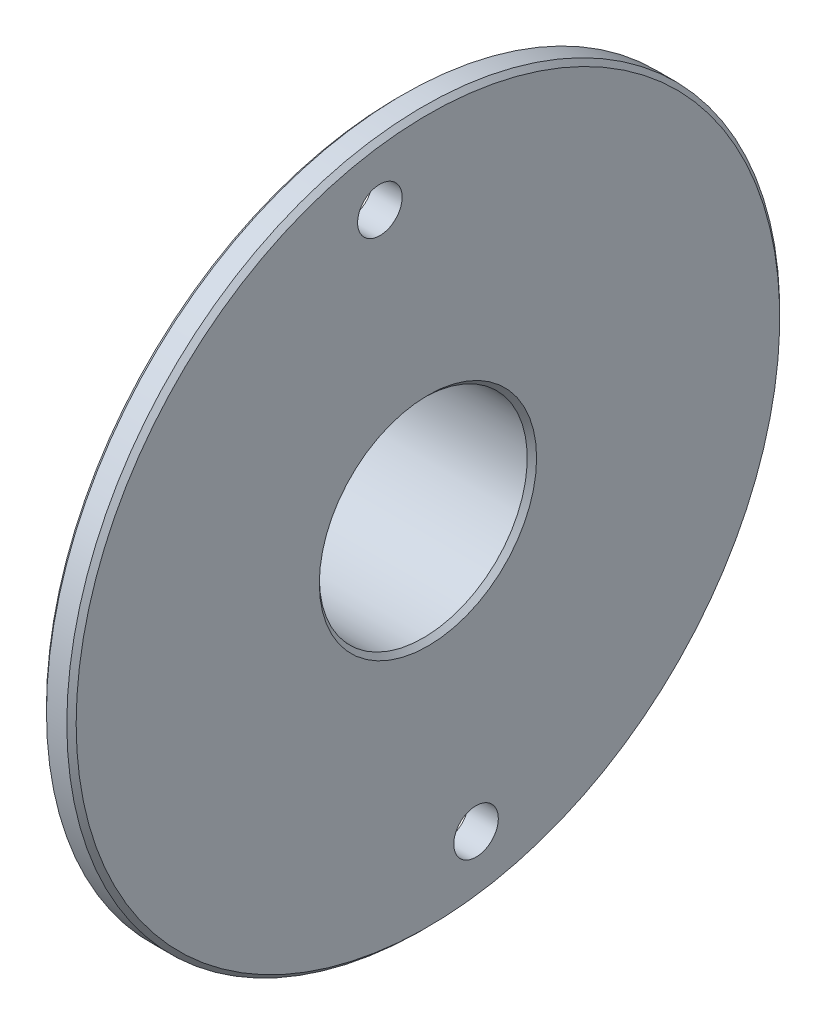
ISO-10303-21;
HEADER;
FILE_DESCRIPTION(('STEP AP214'),'2;1');
FILE_NAME('part.step','',(''),(''),'','','');
FILE_SCHEMA(('AUTOMOTIVE_DESIGN { 1 0 10303 214 1 1 1 1 }'));
ENDSEC;
DATA;
#1=APPLICATION_CONTEXT('core data for automotive mechanical design processes');
#2=APPLICATION_PROTOCOL_DEFINITION('international standard','automotive_design',2000,#1);
#3=PRODUCT_CONTEXT('',#1,'mechanical');
#4=PRODUCT('Part','Part','',(#3));
#5=PRODUCT_RELATED_PRODUCT_CATEGORY('part','',(#4));
#6=PRODUCT_DEFINITION_FORMATION('','',#4);
#7=PRODUCT_DEFINITION_CONTEXT('part definition',#1,'design');
#8=PRODUCT_DEFINITION('design','',#6,#7);
#9=PRODUCT_DEFINITION_SHAPE('','',#8);
#10=(LENGTH_UNIT() NAMED_UNIT(*) SI_UNIT(.MILLI.,.METRE.));
#11=(NAMED_UNIT(*) PLANE_ANGLE_UNIT() SI_UNIT($,.RADIAN.));
#12=(NAMED_UNIT(*) SI_UNIT($,.STERADIAN.) SOLID_ANGLE_UNIT());
#13=UNCERTAINTY_MEASURE_WITH_UNIT(LENGTH_MEASURE(1.E-05),#10,'distance_accuracy_value','');
#14=(GEOMETRIC_REPRESENTATION_CONTEXT(3) GLOBAL_UNCERTAINTY_ASSIGNED_CONTEXT((#13)) GLOBAL_UNIT_ASSIGNED_CONTEXT((#10,
#11,#12)) REPRESENTATION_CONTEXT('',''));
#15=CARTESIAN_POINT('',(0.,0.,0.));
#16=DIRECTION('',(0.,0.,1.));
#17=DIRECTION('',(1.,0.,0.));
#18=AXIS2_PLACEMENT_3D('',#15,#16,#17);
#19=CARTESIAN_POINT('',(0.,14.2875,0.));
#20=DIRECTION('',(1.,0.,0.));
#21=DIRECTION('',(0.,0.,-1.));
#22=AXIS2_PLACEMENT_3D('',#19,#20,#21);
#23=PLANE('',#22);
#24=CARTESIAN_POINT('',(0.,31.3312952376656,5.1393033312147));
#25=DIRECTION('',(1.,0.,0.));
#26=DIRECTION('',(0.,0.,-1.));
#27=AXIS2_PLACEMENT_3D('',#24,#25,#26);
#28=CIRCLE('',#27,2.38125);
#29=CARTESIAN_POINT('',(0.,31.3312952376656,2.7580533312147));
#30=VERTEX_POINT('',#29);
#31=EDGE_CURVE('E90',#30,#30,#28,.T.);
#32=ORIENTED_EDGE('',*,*,#31,.T.);
#33=EDGE_LOOP('',(#32));
#34=FACE_BOUND('',#33,.T.);
#35=CARTESIAN_POINT('',(0.,-31.3312952376656,-5.13930333121448));
#36=DIRECTION('',(1.,0.,0.));
#37=DIRECTION('',(0.,0.,-1.));
#38=AXIS2_PLACEMENT_3D('',#35,#36,#37);
#39=CIRCLE('',#38,2.38125);
#40=CARTESIAN_POINT('',(0.,-31.3312952376656,-7.52055333121448));
#41=VERTEX_POINT('',#40);
#42=EDGE_CURVE('E94',#41,#41,#39,.T.);
#43=ORIENTED_EDGE('',*,*,#42,.T.);
#44=EDGE_LOOP('',(#43));
#45=FACE_BOUND('',#44,.T.);
#46=CARTESIAN_POINT('',(0.,0.,0.));
#47=DIRECTION('',(-1.,0.,0.));
#48=DIRECTION('',(0.,0.,1.));
#49=AXIS2_PLACEMENT_3D('',#46,#47,#48);
#50=CIRCLE('',#49,14.2875);
#51=CARTESIAN_POINT('',(0.,0.,14.2875));
#52=VERTEX_POINT('',#51);
#53=EDGE_CURVE('E86',#52,#52,#50,.T.);
#54=ORIENTED_EDGE('',*,*,#53,.F.);
#55=EDGE_LOOP('',(#54));
#56=FACE_BOUND('',#55,.T.);
#57=CARTESIAN_POINT('',(0.,0.,0.));
#58=DIRECTION('',(-1.,0.,0.));
#59=DIRECTION('',(0.,0.,1.));
#60=AXIS2_PLACEMENT_3D('',#57,#58,#59);
#61=CIRCLE('',#60,37.6);
#62=CARTESIAN_POINT('',(0.,0.,37.6));
#63=VERTEX_POINT('',#62);
#64=EDGE_CURVE('E10',#63,#63,#61,.T.);
#65=ORIENTED_EDGE('',*,*,#64,.T.);
#66=EDGE_LOOP('',(#65));
#67=FACE_BOUND('',#66,.T.);
#68=ADVANCED_FACE('F37',(#34,#45,#56,#67),#23,.F.);
#69=CARTESIAN_POINT('',(0.5,0.,0.));
#70=DIRECTION('',(1.,0.,0.));
#71=DIRECTION('',(0.,0.,-1.));
#72=AXIS2_PLACEMENT_3D('',#69,#70,#71);
#73=CONICAL_SURFACE('',#72,38.1,0.785398163397456);
#74=ORIENTED_EDGE('',*,*,#64,.F.);
#75=EDGE_LOOP('',(#74));
#76=FACE_BOUND('',#75,.T.);
#77=CARTESIAN_POINT('',(0.5,0.,0.));
#78=DIRECTION('',(-1.,0.,0.));
#79=DIRECTION('',(0.,0.,1.));
#80=AXIS2_PLACEMENT_3D('',#77,#78,#79);
#81=CIRCLE('',#80,38.1);
#82=CARTESIAN_POINT('',(0.5,0.,38.1));
#83=VERTEX_POINT('',#82);
#84=EDGE_CURVE('E44',#83,#83,#81,.T.);
#85=ORIENTED_EDGE('',*,*,#84,.T.);
#86=EDGE_LOOP('',(#85));
#87=FACE_BOUND('',#86,.T.);
#88=ADVANCED_FACE('F160',(#76,#87),#73,.T.);
#89=CARTESIAN_POINT('',(0.,0.,0.));
#90=DIRECTION('',(-1.,0.,0.));
#91=DIRECTION('',(0.,0.,1.));
#92=AXIS2_PLACEMENT_3D('',#89,#90,#91);
#93=CYLINDRICAL_SURFACE('',#92,38.1);
#94=ORIENTED_EDGE('',*,*,#84,.F.);
#95=EDGE_LOOP('',(#94));
#96=FACE_BOUND('',#95,.T.);
#97=CARTESIAN_POINT('',(2.675,0.,0.));
#98=DIRECTION('',(-1.,0.,0.));
#99=DIRECTION('',(0.,0.,1.));
#100=AXIS2_PLACEMENT_3D('',#97,#98,#99);
#101=CIRCLE('',#100,38.1);
#102=CARTESIAN_POINT('',(2.675,0.,38.1));
#103=VERTEX_POINT('',#102);
#104=EDGE_CURVE('E50',#103,#103,#101,.T.);
#105=ORIENTED_EDGE('',*,*,#104,.T.);
#106=EDGE_LOOP('',(#105));
#107=FACE_BOUND('',#106,.T.);
#108=ADVANCED_FACE('F165',(#96,#107),#93,.T.);
#109=CARTESIAN_POINT('',(3.175,0.,0.));
#110=DIRECTION('',(-1.,0.,0.));
#111=DIRECTION('',(0.,0.,1.));
#112=AXIS2_PLACEMENT_3D('',#109,#110,#111);
#113=CONICAL_SURFACE('',#112,37.6,0.785398163397449);
#114=ORIENTED_EDGE('',*,*,#104,.F.);
#115=EDGE_LOOP('',(#114));
#116=FACE_BOUND('',#115,.T.);
#117=CARTESIAN_POINT('',(3.175,0.,0.));
#118=DIRECTION('',(-1.,0.,0.));
#119=DIRECTION('',(0.,0.,1.));
#120=AXIS2_PLACEMENT_3D('',#117,#118,#119);
#121=CIRCLE('',#120,37.6);
#122=CARTESIAN_POINT('',(3.175,0.,37.6));
#123=VERTEX_POINT('',#122);
#124=EDGE_CURVE('E56',#123,#123,#121,.T.);
#125=ORIENTED_EDGE('',*,*,#124,.T.);
#126=EDGE_LOOP('',(#125));
#127=FACE_BOUND('',#126,.T.);
#128=ADVANCED_FACE('F115',(#116,#127),#113,.T.);
#129=CARTESIAN_POINT('',(3.175,37.6,0.));
#130=DIRECTION('',(-1.,0.,0.));
#131=DIRECTION('',(0.,0.,1.));
#132=AXIS2_PLACEMENT_3D('',#129,#130,#131);
#133=PLANE('',#132);
#134=CARTESIAN_POINT('',(3.175,31.3312952376656,5.1393033312147));
#135=DIRECTION('',(1.,0.,0.));
#136=DIRECTION('',(0.,0.,-1.));
#137=AXIS2_PLACEMENT_3D('',#134,#135,#136);
#138=CIRCLE('',#137,2.38125);
#139=CARTESIAN_POINT('',(3.175,31.3312952376656,2.7580533312147));
#140=VERTEX_POINT('',#139);
#141=EDGE_CURVE('E98',#140,#140,#138,.T.);
#142=ORIENTED_EDGE('',*,*,#141,.F.);
#143=EDGE_LOOP('',(#142));
#144=FACE_BOUND('',#143,.T.);
#145=CARTESIAN_POINT('',(3.175,-31.3312952376656,-5.13930333121448));
#146=DIRECTION('',(1.,0.,0.));
#147=DIRECTION('',(0.,0.,-1.));
#148=AXIS2_PLACEMENT_3D('',#145,#146,#147);
#149=CIRCLE('',#148,2.38125);
#150=CARTESIAN_POINT('',(3.175,-31.3312952376656,-7.52055333121448));
#151=VERTEX_POINT('',#150);
#152=EDGE_CURVE('E99',#151,#151,#149,.T.);
#153=ORIENTED_EDGE('',*,*,#152,.F.);
#154=EDGE_LOOP('',(#153));
#155=FACE_BOUND('',#154,.T.);
#156=ORIENTED_EDGE('',*,*,#124,.F.);
#157=EDGE_LOOP('',(#156));
#158=FACE_BOUND('',#157,.T.);
#159=CARTESIAN_POINT('',(3.17500000000001,0.,0.));
#160=DIRECTION('',(-1.,0.,0.));
#161=DIRECTION('',(0.,0.,1.));
#162=AXIS2_PLACEMENT_3D('',#159,#160,#161);
#163=CIRCLE('',#162,11.6125);
#164=CARTESIAN_POINT('',(3.17500000000001,0.,11.6125));
#165=VERTEX_POINT('',#164);
#166=EDGE_CURVE('E62',#165,#165,#163,.T.);
#167=ORIENTED_EDGE('',*,*,#166,.T.);
#168=EDGE_LOOP('',(#167));
#169=FACE_BOUND('',#168,.T.);
#170=ADVANCED_FACE('F111',(#144,#155,#158,#169),#133,.F.);
#171=CARTESIAN_POINT('',(2.67500000000001,0.,0.));
#172=DIRECTION('',(1.,0.,0.));
#173=DIRECTION('',(0.,0.,-1.));
#174=AXIS2_PLACEMENT_3D('',#171,#172,#173);
#175=CONICAL_SURFACE('',#174,11.1125,0.785398163397449);
#176=ORIENTED_EDGE('',*,*,#166,.F.);
#177=EDGE_LOOP('',(#176));
#178=FACE_BOUND('',#177,.T.);
#179=CARTESIAN_POINT('',(2.67500000000001,0.,0.));
#180=DIRECTION('',(-1.,0.,0.));
#181=DIRECTION('',(0.,0.,1.));
#182=AXIS2_PLACEMENT_3D('',#179,#180,#181);
#183=CIRCLE('',#182,11.1125);
#184=CARTESIAN_POINT('',(2.67500000000001,0.,11.1125));
#185=VERTEX_POINT('',#184);
#186=EDGE_CURVE('E66',#185,#185,#183,.T.);
#187=ORIENTED_EDGE('',*,*,#186,.T.);
#188=EDGE_LOOP('',(#187));
#189=FACE_BOUND('',#188,.T.);
#190=ADVANCED_FACE('F114',(#178,#189),#175,.F.);
#191=CARTESIAN_POINT('',(0.,0.,0.));
#192=DIRECTION('',(-1.,0.,0.));
#193=DIRECTION('',(0.,0.,1.));
#194=AXIS2_PLACEMENT_3D('',#191,#192,#193);
#195=CYLINDRICAL_SURFACE('',#194,11.1125);
#196=ORIENTED_EDGE('',*,*,#186,.F.);
#197=EDGE_LOOP('',(#196));
#198=FACE_BOUND('',#197,.T.);
#199=CARTESIAN_POINT('',(-15.325,0.,0.));
#200=DIRECTION('',(-1.,0.,0.));
#201=DIRECTION('',(0.,0.,1.));
#202=AXIS2_PLACEMENT_3D('',#199,#200,#201);
#203=CIRCLE('',#202,11.1125);
#204=CARTESIAN_POINT('',(-15.325,0.,11.1125));
#205=VERTEX_POINT('',#204);
#206=EDGE_CURVE('E70',#205,#205,#203,.T.);
#207=ORIENTED_EDGE('',*,*,#206,.T.);
#208=EDGE_LOOP('',(#207));
#209=FACE_BOUND('',#208,.T.);
#210=ADVANCED_FACE('F125',(#198,#209),#195,.F.);
#211=CARTESIAN_POINT('',(-15.825,0.,0.));
#212=DIRECTION('',(-1.,0.,0.));
#213=DIRECTION('',(0.,0.,1.));
#214=AXIS2_PLACEMENT_3D('',#211,#212,#213);
#215=CONICAL_SURFACE('',#214,11.6125,0.785398163397448);
#216=ORIENTED_EDGE('',*,*,#206,.F.);
#217=EDGE_LOOP('',(#216));
#218=FACE_BOUND('',#217,.T.);
#219=CARTESIAN_POINT('',(-15.825,0.,0.));
#220=DIRECTION('',(-1.,0.,0.));
#221=DIRECTION('',(0.,0.,1.));
#222=AXIS2_PLACEMENT_3D('',#219,#220,#221);
#223=CIRCLE('',#222,11.6125);
#224=CARTESIAN_POINT('',(-15.825,0.,11.6125));
#225=VERTEX_POINT('',#224);
#226=EDGE_CURVE('E74',#225,#225,#223,.T.);
#227=ORIENTED_EDGE('',*,*,#226,.T.);
#228=EDGE_LOOP('',(#227));
#229=FACE_BOUND('',#228,.T.);
#230=ADVANCED_FACE('F131',(#218,#229),#215,.F.);
#231=CARTESIAN_POINT('',(-15.825,13.7875,0.));
#232=DIRECTION('',(1.,0.,0.));
#233=DIRECTION('',(0.,0.,-1.));
#234=AXIS2_PLACEMENT_3D('',#231,#232,#233);
#235=PLANE('',#234);
#236=ORIENTED_EDGE('',*,*,#226,.F.);
#237=EDGE_LOOP('',(#236));
#238=FACE_BOUND('',#237,.T.);
#239=CARTESIAN_POINT('',(-15.825,0.,0.));
#240=DIRECTION('',(-1.,0.,0.));
#241=DIRECTION('',(0.,0.,1.));
#242=AXIS2_PLACEMENT_3D('',#239,#240,#241);
#243=CIRCLE('',#242,13.7875);
#244=CARTESIAN_POINT('',(-15.825,0.,13.7875));
#245=VERTEX_POINT('',#244);
#246=EDGE_CURVE('E78',#245,#245,#243,.T.);
#247=ORIENTED_EDGE('',*,*,#246,.T.);
#248=EDGE_LOOP('',(#247));
#249=FACE_BOUND('',#248,.T.);
#250=ADVANCED_FACE('F137',(#238,#249),#235,.F.);
#251=CARTESIAN_POINT('',(-15.325,0.,0.));
#252=DIRECTION('',(1.,0.,0.));
#253=DIRECTION('',(0.,0.,-1.));
#254=AXIS2_PLACEMENT_3D('',#251,#252,#253);
#255=CONICAL_SURFACE('',#254,14.2875,0.785398163397448);
#256=ORIENTED_EDGE('',*,*,#246,.F.);
#257=EDGE_LOOP('',(#256));
#258=FACE_BOUND('',#257,.T.);
#259=CARTESIAN_POINT('',(-15.325,0.,0.));
#260=DIRECTION('',(-1.,0.,0.));
#261=DIRECTION('',(0.,0.,1.));
#262=AXIS2_PLACEMENT_3D('',#259,#260,#261);
#263=CIRCLE('',#262,14.2875);
#264=CARTESIAN_POINT('',(-15.325,0.,14.2875));
#265=VERTEX_POINT('',#264);
#266=EDGE_CURVE('E82',#265,#265,#263,.T.);
#267=ORIENTED_EDGE('',*,*,#266,.T.);
#268=EDGE_LOOP('',(#267));
#269=FACE_BOUND('',#268,.T.);
#270=ADVANCED_FACE('F143',(#258,#269),#255,.T.);
#271=CARTESIAN_POINT('',(0.,0.,0.));
#272=DIRECTION('',(-1.,0.,0.));
#273=DIRECTION('',(0.,0.,1.));
#274=AXIS2_PLACEMENT_3D('',#271,#272,#273);
#275=CYLINDRICAL_SURFACE('',#274,14.2875);
#276=ORIENTED_EDGE('',*,*,#266,.F.);
#277=EDGE_LOOP('',(#276));
#278=FACE_BOUND('',#277,.T.);
#279=ORIENTED_EDGE('',*,*,#53,.T.);
#280=EDGE_LOOP('',(#279));
#281=FACE_BOUND('',#280,.T.);
#282=ADVANCED_FACE('F149',(#278,#281),#275,.T.);
#283=CARTESIAN_POINT('',(-6.825,-31.3312952376656,-5.13930333121448));
#284=DIRECTION('',(1.,0.,0.));
#285=DIRECTION('',(0.,0.,-1.));
#286=AXIS2_PLACEMENT_3D('',#283,#284,#285);
#287=CYLINDRICAL_SURFACE('',#286,2.38125);
#288=ORIENTED_EDGE('',*,*,#152,.T.);
#289=EDGE_LOOP('',(#288));
#290=FACE_BOUND('',#289,.T.);
#291=ORIENTED_EDGE('',*,*,#42,.F.);
#292=EDGE_LOOP('',(#291));
#293=FACE_BOUND('',#292,.T.);
#294=ADVANCED_FACE('F155',(#290,#293),#287,.F.);
#295=CARTESIAN_POINT('',(-6.825,31.3312952376656,5.1393033312147));
#296=DIRECTION('',(1.,0.,0.));
#297=DIRECTION('',(0.,0.,-1.));
#298=AXIS2_PLACEMENT_3D('',#295,#296,#297);
#299=CYLINDRICAL_SURFACE('',#298,2.38125);
#300=ORIENTED_EDGE('',*,*,#141,.T.);
#301=EDGE_LOOP('',(#300));
#302=FACE_BOUND('',#301,.T.);
#303=ORIENTED_EDGE('',*,*,#31,.F.);
#304=EDGE_LOOP('',(#303));
#305=FACE_BOUND('',#304,.T.);
#306=ADVANCED_FACE('F108',(#302,#305),#299,.F.);
#307=CLOSED_SHELL('',(#68,#88,#108,#128,#170,#190,#210,#230,#250,#270,#282,#294,#306));
#308=MANIFOLD_SOLID_BREP('B2',#307);
#309=ADVANCED_BREP_SHAPE_REPRESENTATION('',(#18,#308),#14);
#310=SHAPE_DEFINITION_REPRESENTATION(#9,#309);
ENDSEC;
END-ISO-10303-21;
